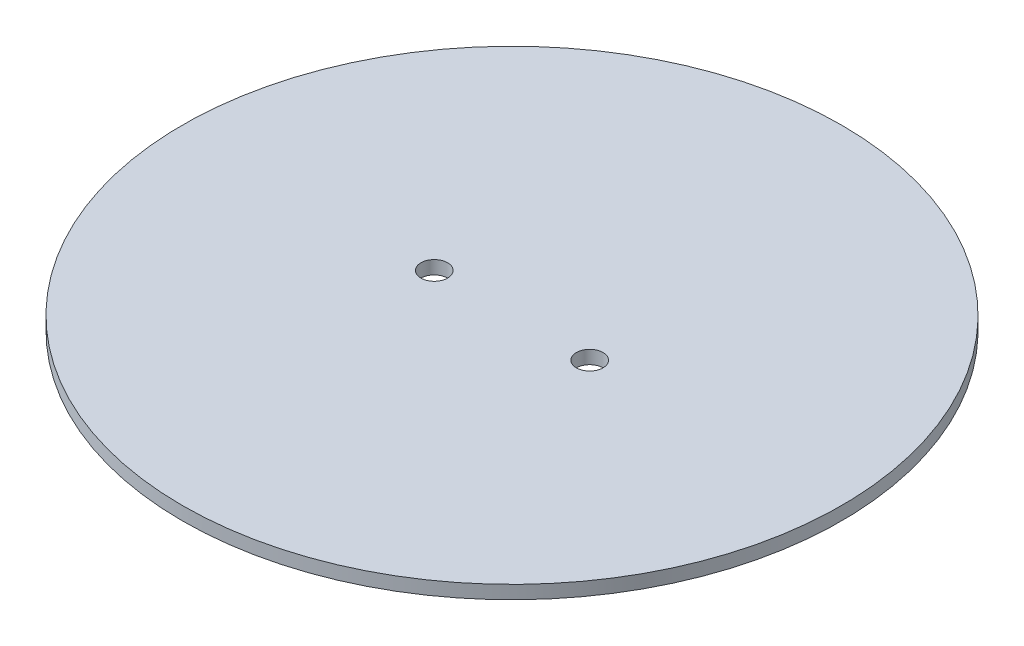
ISO-10303-21;
HEADER;
FILE_DESCRIPTION(('STEP AP214'),'2;1');
FILE_NAME('part.step','',(''),(''),'','','');
FILE_SCHEMA(('AUTOMOTIVE_DESIGN { 1 0 10303 214 1 1 1 1 }'));
ENDSEC;
DATA;
#1=APPLICATION_CONTEXT('core data for automotive mechanical design processes');
#2=APPLICATION_PROTOCOL_DEFINITION('international standard','automotive_design',2000,#1);
#3=PRODUCT_CONTEXT('',#1,'mechanical');
#4=PRODUCT('Part','Part','',(#3));
#5=PRODUCT_RELATED_PRODUCT_CATEGORY('part','',(#4));
#6=PRODUCT_DEFINITION_FORMATION('','',#4);
#7=PRODUCT_DEFINITION_CONTEXT('part definition',#1,'design');
#8=PRODUCT_DEFINITION('design','',#6,#7);
#9=PRODUCT_DEFINITION_SHAPE('','',#8);
#10=(LENGTH_UNIT() NAMED_UNIT(*) SI_UNIT(.MILLI.,.METRE.));
#11=(NAMED_UNIT(*) PLANE_ANGLE_UNIT() SI_UNIT($,.RADIAN.));
#12=(NAMED_UNIT(*) SI_UNIT($,.STERADIAN.) SOLID_ANGLE_UNIT());
#13=UNCERTAINTY_MEASURE_WITH_UNIT(LENGTH_MEASURE(1.E-05),#10,'distance_accuracy_value','');
#14=(GEOMETRIC_REPRESENTATION_CONTEXT(3) GLOBAL_UNCERTAINTY_ASSIGNED_CONTEXT((#13)) GLOBAL_UNIT_ASSIGNED_CONTEXT((#10,
#11,#12)) REPRESENTATION_CONTEXT('',''));
#15=CARTESIAN_POINT('',(0.,0.,0.));
#16=DIRECTION('',(0.,0.,1.));
#17=DIRECTION('',(1.,0.,0.));
#18=AXIS2_PLACEMENT_3D('',#15,#16,#17);
#19=CARTESIAN_POINT('',(0.,3.,0.));
#20=DIRECTION('',(0.,1.,0.));
#21=DIRECTION('',(0.,0.,1.));
#22=AXIS2_PLACEMENT_3D('',#19,#20,#21);
#23=PLANE('',#22);
#24=CARTESIAN_POINT('',(-17.5,3.,0.));
#25=DIRECTION('',(0.,1.,0.));
#26=DIRECTION('',(0.,0.,1.));
#27=AXIS2_PLACEMENT_3D('',#24,#25,#26);
#28=CIRCLE('',#27,3.);
#29=CARTESIAN_POINT('',(-17.5,3.,3.));
#30=VERTEX_POINT('',#29);
#31=EDGE_CURVE('E55',#30,#30,#28,.T.);
#32=ORIENTED_EDGE('',*,*,#31,.F.);
#33=EDGE_LOOP('',(#32));
#34=FACE_BOUND('',#33,.T.);
#35=CARTESIAN_POINT('',(0.,3.,0.));
#36=DIRECTION('',(0.,1.,0.));
#37=DIRECTION('',(0.,0.,1.));
#38=AXIS2_PLACEMENT_3D('',#35,#36,#37);
#39=CIRCLE('',#38,74.2);
#40=CARTESIAN_POINT('',(0.,3.,74.2));
#41=VERTEX_POINT('',#40);
#42=EDGE_CURVE('E10',#41,#41,#39,.T.);
#43=ORIENTED_EDGE('',*,*,#42,.T.);
#44=EDGE_LOOP('',(#43));
#45=FACE_BOUND('',#44,.T.);
#46=CARTESIAN_POINT('',(17.5,3.,0.));
#47=DIRECTION('',(0.,1.,0.));
#48=DIRECTION('',(0.,0.,1.));
#49=AXIS2_PLACEMENT_3D('',#46,#47,#48);
#50=CIRCLE('',#49,3.);
#51=CARTESIAN_POINT('',(17.5,3.,3.));
#52=VERTEX_POINT('',#51);
#53=EDGE_CURVE('E61',#52,#52,#50,.T.);
#54=ORIENTED_EDGE('',*,*,#53,.F.);
#55=EDGE_LOOP('',(#54));
#56=FACE_BOUND('',#55,.T.);
#57=ADVANCED_FACE('F41',(#34,#45,#56),#23,.T.);
#58=CARTESIAN_POINT('',(0.,0.,0.));
#59=DIRECTION('',(0.,1.,0.));
#60=DIRECTION('',(0.,0.,1.));
#61=AXIS2_PLACEMENT_3D('',#58,#59,#60);
#62=PLANE('',#61);
#63=CARTESIAN_POINT('',(0.,0.,0.));
#64=DIRECTION('',(0.,1.,0.));
#65=DIRECTION('',(0.,0.,1.));
#66=AXIS2_PLACEMENT_3D('',#63,#64,#65);
#67=CIRCLE('',#66,74.2);
#68=CARTESIAN_POINT('',(0.,0.,74.2));
#69=VERTEX_POINT('',#68);
#70=EDGE_CURVE('E45',#69,#69,#67,.T.);
#71=ORIENTED_EDGE('',*,*,#70,.F.);
#72=EDGE_LOOP('',(#71));
#73=FACE_BOUND('',#72,.T.);
#74=CARTESIAN_POINT('',(-17.5,0.,0.));
#75=DIRECTION('',(0.,1.,0.));
#76=DIRECTION('',(0.,0.,1.));
#77=AXIS2_PLACEMENT_3D('',#74,#75,#76);
#78=CIRCLE('',#77,3.);
#79=CARTESIAN_POINT('',(-17.5,0.,3.));
#80=VERTEX_POINT('',#79);
#81=EDGE_CURVE('E57',#80,#80,#78,.T.);
#82=ORIENTED_EDGE('',*,*,#81,.T.);
#83=EDGE_LOOP('',(#82));
#84=FACE_BOUND('',#83,.T.);
#85=CARTESIAN_POINT('',(17.5,0.,0.));
#86=DIRECTION('',(0.,1.,0.));
#87=DIRECTION('',(0.,0.,1.));
#88=AXIS2_PLACEMENT_3D('',#85,#86,#87);
#89=CIRCLE('',#88,3.);
#90=CARTESIAN_POINT('',(17.5,0.,3.));
#91=VERTEX_POINT('',#90);
#92=EDGE_CURVE('E65',#91,#91,#89,.T.);
#93=ORIENTED_EDGE('',*,*,#92,.T.);
#94=EDGE_LOOP('',(#93));
#95=FACE_BOUND('',#94,.T.);
#96=ADVANCED_FACE('F78',(#73,#84,#95),#62,.F.);
#97=CARTESIAN_POINT('',(0.,3.,0.));
#98=DIRECTION('',(0.,-1.,0.));
#99=DIRECTION('',(0.,0.,-1.));
#100=AXIS2_PLACEMENT_3D('',#97,#98,#99);
#101=CYLINDRICAL_SURFACE('',#100,74.2);
#102=ORIENTED_EDGE('',*,*,#42,.F.);
#103=EDGE_LOOP('',(#102));
#104=FACE_BOUND('',#103,.T.);
#105=ORIENTED_EDGE('',*,*,#70,.T.);
#106=EDGE_LOOP('',(#105));
#107=FACE_BOUND('',#106,.T.);
#108=ADVANCED_FACE('F43',(#104,#107),#101,.T.);
#109=CARTESIAN_POINT('',(-17.5,3.,0.));
#110=DIRECTION('',(0.,-1.,0.));
#111=DIRECTION('',(0.,0.,-1.));
#112=AXIS2_PLACEMENT_3D('',#109,#110,#111);
#113=CYLINDRICAL_SURFACE('',#112,3.);
#114=ORIENTED_EDGE('',*,*,#31,.T.);
#115=EDGE_LOOP('',(#114));
#116=FACE_BOUND('',#115,.T.);
#117=ORIENTED_EDGE('',*,*,#81,.F.);
#118=EDGE_LOOP('',(#117));
#119=FACE_BOUND('',#118,.T.);
#120=ADVANCED_FACE('F87',(#116,#119),#113,.F.);
#121=CARTESIAN_POINT('',(17.5,3.,0.));
#122=DIRECTION('',(0.,-1.,0.));
#123=DIRECTION('',(0.,0.,-1.));
#124=AXIS2_PLACEMENT_3D('',#121,#122,#123);
#125=CYLINDRICAL_SURFACE('',#124,3.);
#126=ORIENTED_EDGE('',*,*,#53,.T.);
#127=EDGE_LOOP('',(#126));
#128=FACE_BOUND('',#127,.T.);
#129=ORIENTED_EDGE('',*,*,#92,.F.);
#130=EDGE_LOOP('',(#129));
#131=FACE_BOUND('',#130,.T.);
#132=ADVANCED_FACE('F74',(#128,#131),#125,.F.);
#133=CLOSED_SHELL('',(#57,#96,#108,#120,#132));
#134=MANIFOLD_SOLID_BREP('B2',#133);
#135=ADVANCED_BREP_SHAPE_REPRESENTATION('',(#18,#134),#14);
#136=SHAPE_DEFINITION_REPRESENTATION(#9,#135);
ENDSEC;
END-ISO-10303-21;
